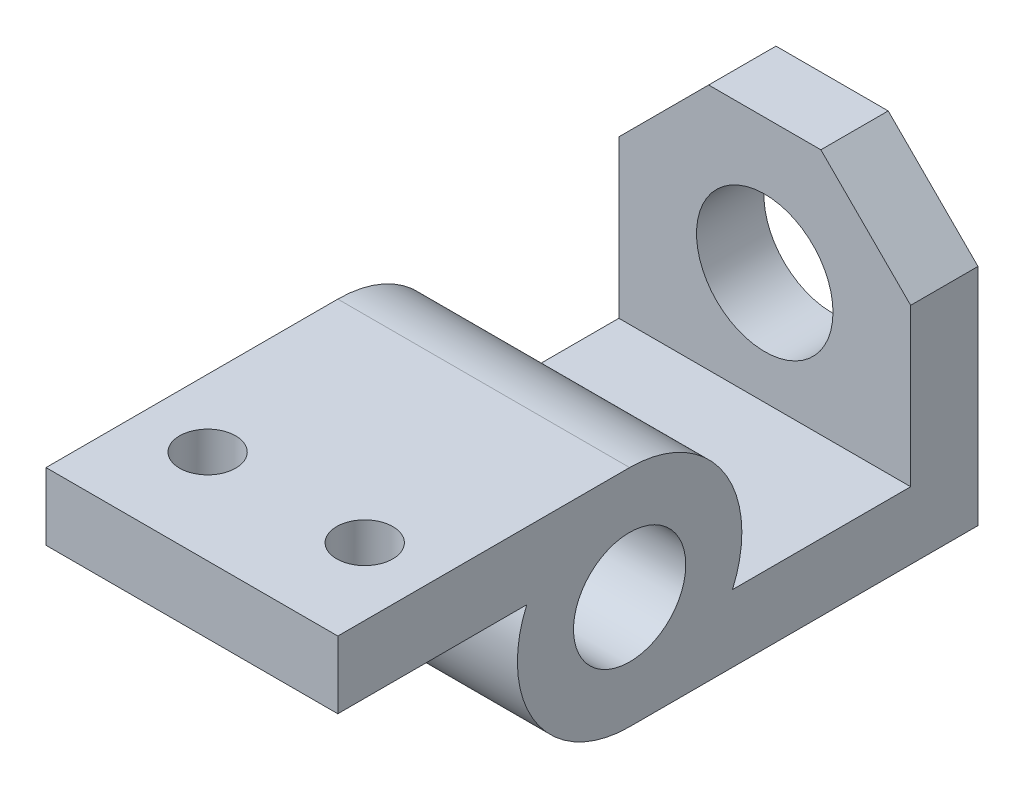
ISO-10303-21;
HEADER;
FILE_DESCRIPTION(('STEP AP214'),'2;1');
FILE_NAME('part.step','',(''),(''),'','','');
FILE_SCHEMA(('AUTOMOTIVE_DESIGN { 1 0 10303 214 1 1 1 1 }'));
ENDSEC;
DATA;
#1=APPLICATION_CONTEXT('core data for automotive mechanical design processes');
#2=APPLICATION_PROTOCOL_DEFINITION('international standard','automotive_design',2000,#1);
#3=PRODUCT_CONTEXT('',#1,'mechanical');
#4=PRODUCT('Part','Part','',(#3));
#5=PRODUCT_RELATED_PRODUCT_CATEGORY('part','',(#4));
#6=PRODUCT_DEFINITION_FORMATION('','',#4);
#7=PRODUCT_DEFINITION_CONTEXT('part definition',#1,'design');
#8=PRODUCT_DEFINITION('design','',#6,#7);
#9=PRODUCT_DEFINITION_SHAPE('','',#8);
#10=(LENGTH_UNIT() NAMED_UNIT(*) SI_UNIT(.MILLI.,.METRE.));
#11=(NAMED_UNIT(*) PLANE_ANGLE_UNIT() SI_UNIT($,.RADIAN.));
#12=(NAMED_UNIT(*) SI_UNIT($,.STERADIAN.) SOLID_ANGLE_UNIT());
#13=UNCERTAINTY_MEASURE_WITH_UNIT(LENGTH_MEASURE(1.E-05),#10,'distance_accuracy_value','');
#14=(GEOMETRIC_REPRESENTATION_CONTEXT(3) GLOBAL_UNCERTAINTY_ASSIGNED_CONTEXT((#13)) GLOBAL_UNIT_ASSIGNED_CONTEXT((#10,
#11,#12)) REPRESENTATION_CONTEXT('',''));
#15=CARTESIAN_POINT('',(0.,0.,0.));
#16=DIRECTION('',(0.,0.,1.));
#17=DIRECTION('',(1.,0.,0.));
#18=AXIS2_PLACEMENT_3D('',#15,#16,#17);
#19=CARTESIAN_POINT('',(-82.55,0.,0.));
#20=DIRECTION('',(1.,0.,0.));
#21=DIRECTION('',(0.,0.,-1.));
#22=AXIS2_PLACEMENT_3D('',#19,#20,#21);
#23=CYLINDRICAL_SURFACE('',#22,31.75);
#24=CARTESIAN_POINT('',(0.,0.,0.));
#25=DIRECTION('',(1.,0.,0.));
#26=DIRECTION('',(0.,0.,-1.));
#27=AXIS2_PLACEMENT_3D('',#24,#25,#26);
#28=CIRCLE('',#27,31.75);
#29=CARTESIAN_POINT('',(0.,-31.75,0.));
#30=VERTEX_POINT('',#29);
#31=CARTESIAN_POINT('',(0.,12.7,29.0993556629696));
#32=VERTEX_POINT('',#31);
#33=EDGE_CURVE('E204',#30,#32,#28,.F.);
#34=ORIENTED_EDGE('',*,*,#33,.T.);
#35=DIRECTION('',(1.,0.,0.));
#36=VECTOR('',#35,1.);
#37=CARTESIAN_POINT('',(-82.55,12.7,29.0993556629696));
#38=LINE('',#37,#36);
#39=CARTESIAN_POINT('',(-82.55,12.7,29.0993556629696));
#40=VERTEX_POINT('',#39);
#41=EDGE_CURVE('E12',#40,#32,#38,.T.);
#42=ORIENTED_EDGE('',*,*,#41,.F.);
#43=CARTESIAN_POINT('',(-82.55,0.,0.));
#44=DIRECTION('',(1.,0.,0.));
#45=DIRECTION('',(0.,0.,-1.));
#46=AXIS2_PLACEMENT_3D('',#43,#44,#45);
#47=CIRCLE('',#46,31.75);
#48=CARTESIAN_POINT('',(-82.55,-31.75,0.));
#49=VERTEX_POINT('',#48);
#50=EDGE_CURVE('E183',#49,#40,#47,.F.);
#51=ORIENTED_EDGE('',*,*,#50,.F.);
#52=DIRECTION('',(1.,0.,0.));
#53=VECTOR('',#52,1.);
#54=CARTESIAN_POINT('',(-82.55,-31.75,0.));
#55=LINE('',#54,#53);
#56=EDGE_CURVE('E60',#49,#30,#55,.T.);
#57=ORIENTED_EDGE('',*,*,#56,.T.);
#58=EDGE_LOOP('',(#34,#42,#51,#57));
#59=FACE_BOUND('',#58,.T.);
#60=ADVANCED_FACE('F57',(#59),#23,.T.);
#61=CARTESIAN_POINT('',(-82.55,12.7,0.));
#62=DIRECTION('',(0.,-1.,0.));
#63=DIRECTION('',(0.,0.,-1.));
#64=AXIS2_PLACEMENT_3D('',#61,#62,#63);
#65=PLANE('',#64);
#66=CARTESIAN_POINT('',(-63.5,12.7,55.88));
#67=DIRECTION('',(0.,-1.,0.));
#68=DIRECTION('',(0.,0.,-1.));
#69=AXIS2_PLACEMENT_3D('',#66,#67,#68);
#70=CIRCLE('',#69,7.9375);
#71=CARTESIAN_POINT('',(-63.5,12.7,47.9425));
#72=VERTEX_POINT('',#71);
#73=EDGE_CURVE('E207',#72,#72,#70,.T.);
#74=ORIENTED_EDGE('',*,*,#73,.F.);
#75=EDGE_LOOP('',(#74));
#76=FACE_BOUND('',#75,.T.);
#77=CARTESIAN_POINT('',(-19.05,12.7,55.88));
#78=DIRECTION('',(0.,-1.,0.));
#79=DIRECTION('',(0.,0.,-1.));
#80=AXIS2_PLACEMENT_3D('',#77,#78,#79);
#81=CIRCLE('',#80,7.9375);
#82=CARTESIAN_POINT('',(-19.05,12.7,47.9425));
#83=VERTEX_POINT('',#82);
#84=EDGE_CURVE('E234',#83,#83,#81,.T.);
#85=ORIENTED_EDGE('',*,*,#84,.F.);
#86=EDGE_LOOP('',(#85));
#87=FACE_BOUND('',#86,.T.);
#88=DIRECTION('',(0.,0.,-1.));
#89=VECTOR('',#88,1.);
#90=CARTESIAN_POINT('',(0.,12.7,0.));
#91=LINE('',#90,#89);
#92=CARTESIAN_POINT('',(0.,12.7,82.55));
#93=VERTEX_POINT('',#92);
#94=EDGE_CURVE('E184',#93,#32,#91,.T.);
#95=ORIENTED_EDGE('',*,*,#94,.F.);
#96=DIRECTION('',(1.,0.,0.));
#97=VECTOR('',#96,1.);
#98=CARTESIAN_POINT('',(-82.55,12.7,82.55));
#99=LINE('',#98,#97);
#100=CARTESIAN_POINT('',(-82.55,12.7,82.55));
#101=VERTEX_POINT('',#100);
#102=EDGE_CURVE('E65',#101,#93,#99,.T.);
#103=ORIENTED_EDGE('',*,*,#102,.F.);
#104=DIRECTION('',(0.,0.,-1.));
#105=VECTOR('',#104,1.);
#106=CARTESIAN_POINT('',(-82.55,12.7,0.));
#107=LINE('',#106,#105);
#108=EDGE_CURVE('E211',#101,#40,#107,.T.);
#109=ORIENTED_EDGE('',*,*,#108,.T.);
#110=ORIENTED_EDGE('',*,*,#41,.T.);
#111=EDGE_LOOP('',(#95,#103,#109,#110));
#112=FACE_BOUND('',#111,.T.);
#113=ADVANCED_FACE('F304',(#76,#87,#112),#65,.T.);
#114=CARTESIAN_POINT('',(-82.55,0.,82.55));
#115=DIRECTION('',(0.,0.,1.));
#116=DIRECTION('',(0.,-1.,0.));
#117=AXIS2_PLACEMENT_3D('',#114,#115,#116);
#118=PLANE('',#117);
#119=DIRECTION('',(0.,-1.,0.));
#120=VECTOR('',#119,1.);
#121=CARTESIAN_POINT('',(0.,0.,82.55));
#122=LINE('',#121,#120);
#123=CARTESIAN_POINT('',(0.,31.75,82.55));
#124=VERTEX_POINT('',#123);
#125=EDGE_CURVE('E187',#124,#93,#122,.T.);
#126=ORIENTED_EDGE('',*,*,#125,.F.);
#127=DIRECTION('',(1.,0.,0.));
#128=VECTOR('',#127,1.);
#129=CARTESIAN_POINT('',(-82.55,31.75,82.55));
#130=LINE('',#129,#128);
#131=CARTESIAN_POINT('',(-82.55,31.75,82.55));
#132=VERTEX_POINT('',#131);
#133=EDGE_CURVE('E177',#132,#124,#130,.T.);
#134=ORIENTED_EDGE('',*,*,#133,.F.);
#135=DIRECTION('',(0.,-1.,0.));
#136=VECTOR('',#135,1.);
#137=CARTESIAN_POINT('',(-82.55,0.,82.55));
#138=LINE('',#137,#136);
#139=EDGE_CURVE('E214',#132,#101,#138,.T.);
#140=ORIENTED_EDGE('',*,*,#139,.T.);
#141=ORIENTED_EDGE('',*,*,#102,.T.);
#142=EDGE_LOOP('',(#126,#134,#140,#141));
#143=FACE_BOUND('',#142,.T.);
#144=ADVANCED_FACE('F310',(#143),#118,.T.);
#145=CARTESIAN_POINT('',(-82.55,31.75,0.));
#146=DIRECTION('',(0.,1.,0.));
#147=DIRECTION('',(0.,0.,1.));
#148=AXIS2_PLACEMENT_3D('',#145,#146,#147);
#149=PLANE('',#148);
#150=CARTESIAN_POINT('',(-63.5,31.75,55.88));
#151=DIRECTION('',(0.,1.,0.));
#152=DIRECTION('',(0.,0.,1.));
#153=AXIS2_PLACEMENT_3D('',#150,#151,#152);
#154=CIRCLE('',#153,7.9375);
#155=CARTESIAN_POINT('',(-63.5,31.75,63.8175));
#156=VERTEX_POINT('',#155);
#157=EDGE_CURVE('E237',#156,#156,#154,.T.);
#158=ORIENTED_EDGE('',*,*,#157,.F.);
#159=EDGE_LOOP('',(#158));
#160=FACE_BOUND('',#159,.T.);
#161=CARTESIAN_POINT('',(-19.05,31.75,55.88));
#162=DIRECTION('',(0.,1.,0.));
#163=DIRECTION('',(0.,0.,1.));
#164=AXIS2_PLACEMENT_3D('',#161,#162,#163);
#165=CIRCLE('',#164,7.9375);
#166=CARTESIAN_POINT('',(-19.05,31.75,63.8175));
#167=VERTEX_POINT('',#166);
#168=EDGE_CURVE('E238',#167,#167,#165,.T.);
#169=ORIENTED_EDGE('',*,*,#168,.F.);
#170=EDGE_LOOP('',(#169));
#171=FACE_BOUND('',#170,.T.);
#172=DIRECTION('',(0.,0.,1.));
#173=VECTOR('',#172,1.);
#174=CARTESIAN_POINT('',(0.,31.75,0.));
#175=LINE('',#174,#173);
#176=CARTESIAN_POINT('',(0.,31.75,0.));
#177=VERTEX_POINT('',#176);
#178=EDGE_CURVE('E190',#177,#124,#175,.T.);
#179=ORIENTED_EDGE('',*,*,#178,.F.);
#180=DIRECTION('',(1.,0.,0.));
#181=VECTOR('',#180,1.);
#182=CARTESIAN_POINT('',(-82.55,31.75,0.));
#183=LINE('',#182,#181);
#184=CARTESIAN_POINT('',(-82.55,31.75,0.));
#185=VERTEX_POINT('',#184);
#186=EDGE_CURVE('E175',#185,#177,#183,.T.);
#187=ORIENTED_EDGE('',*,*,#186,.F.);
#188=DIRECTION('',(0.,0.,1.));
#189=VECTOR('',#188,1.);
#190=CARTESIAN_POINT('',(-82.55,31.75,0.));
#191=LINE('',#190,#189);
#192=EDGE_CURVE('E217',#185,#132,#191,.T.);
#193=ORIENTED_EDGE('',*,*,#192,.T.);
#194=ORIENTED_EDGE('',*,*,#133,.T.);
#195=EDGE_LOOP('',(#179,#187,#193,#194));
#196=FACE_BOUND('',#195,.T.);
#197=ADVANCED_FACE('F321',(#160,#171,#196),#149,.T.);
#198=CARTESIAN_POINT('',(-82.55,0.,0.));
#199=DIRECTION('',(1.,0.,0.));
#200=DIRECTION('',(0.,0.,-1.));
#201=AXIS2_PLACEMENT_3D('',#198,#199,#200);
#202=CYLINDRICAL_SURFACE('',#201,31.75);
#203=CARTESIAN_POINT('',(0.,0.,0.));
#204=DIRECTION('',(1.,0.,0.));
#205=DIRECTION('',(0.,0.,-1.));
#206=AXIS2_PLACEMENT_3D('',#203,#204,#205);
#207=CIRCLE('',#206,31.75);
#208=CARTESIAN_POINT('',(0.,-12.7,-29.0993556629696));
#209=VERTEX_POINT('',#208);
#210=EDGE_CURVE('E193',#177,#209,#207,.F.);
#211=ORIENTED_EDGE('',*,*,#210,.T.);
#212=DIRECTION('',(1.,0.,0.));
#213=VECTOR('',#212,1.);
#214=CARTESIAN_POINT('',(-82.55,-12.7,-29.0993556629696));
#215=LINE('',#214,#213);
#216=CARTESIAN_POINT('',(-82.55,-12.7,-29.0993556629696));
#217=VERTEX_POINT('',#216);
#218=EDGE_CURVE('E172',#217,#209,#215,.T.);
#219=ORIENTED_EDGE('',*,*,#218,.F.);
#220=CARTESIAN_POINT('',(-82.55,0.,0.));
#221=DIRECTION('',(1.,0.,0.));
#222=DIRECTION('',(0.,0.,-1.));
#223=AXIS2_PLACEMENT_3D('',#220,#221,#222);
#224=CIRCLE('',#223,31.75);
#225=EDGE_CURVE('E220',#185,#217,#224,.F.);
#226=ORIENTED_EDGE('',*,*,#225,.F.);
#227=ORIENTED_EDGE('',*,*,#186,.T.);
#228=EDGE_LOOP('',(#211,#219,#226,#227));
#229=FACE_BOUND('',#228,.T.);
#230=ADVANCED_FACE('F325',(#229),#202,.T.);
#231=CARTESIAN_POINT('',(-82.55,-12.7,0.));
#232=DIRECTION('',(0.,-1.,0.));
#233=DIRECTION('',(0.,0.,-1.));
#234=AXIS2_PLACEMENT_3D('',#231,#232,#233);
#235=PLANE('',#234);
#236=DIRECTION('',(0.,0.,-1.));
#237=VECTOR('',#236,1.);
#238=CARTESIAN_POINT('',(0.,-12.7,0.));
#239=LINE('',#238,#237);
#240=CARTESIAN_POINT('',(0.,-12.7,-79.502));
#241=VERTEX_POINT('',#240);
#242=EDGE_CURVE('E195',#209,#241,#239,.T.);
#243=ORIENTED_EDGE('',*,*,#242,.T.);
#244=DIRECTION('',(1.,0.,0.));
#245=VECTOR('',#244,1.);
#246=CARTESIAN_POINT('',(-82.55,-12.7,-79.502));
#247=LINE('',#246,#245);
#248=CARTESIAN_POINT('',(-82.55,-12.7,-79.502));
#249=VERTEX_POINT('',#248);
#250=EDGE_CURVE('E166',#249,#241,#247,.T.);
#251=ORIENTED_EDGE('',*,*,#250,.F.);
#252=DIRECTION('',(0.,0.,-1.));
#253=VECTOR('',#252,1.);
#254=CARTESIAN_POINT('',(-82.55,-12.7,0.));
#255=LINE('',#254,#253);
#256=EDGE_CURVE('E222',#217,#249,#255,.T.);
#257=ORIENTED_EDGE('',*,*,#256,.F.);
#258=ORIENTED_EDGE('',*,*,#218,.T.);
#259=EDGE_LOOP('',(#243,#251,#257,#258));
#260=FACE_BOUND('',#259,.T.);
#261=ADVANCED_FACE('F270',(#260),#235,.F.);
#262=CARTESIAN_POINT('',(-82.55,0.,-79.502));
#263=DIRECTION('',(0.,0.,-1.));
#264=DIRECTION('',(-1.,0.,0.));
#265=AXIS2_PLACEMENT_3D('',#262,#263,#264);
#266=PLANE('',#265);
#267=CARTESIAN_POINT('',(-41.275,19.05,-79.502));
#268=DIRECTION('',(0.,0.,1.));
#269=DIRECTION('',(1.,0.,0.));
#270=AXIS2_PLACEMENT_3D('',#267,#268,#269);
#271=CIRCLE('',#270,19.304);
#272=CARTESIAN_POINT('',(-21.971,19.05,-79.502));
#273=VERTEX_POINT('',#272);
#274=EDGE_CURVE('E253',#273,#273,#271,.T.);
#275=ORIENTED_EDGE('',*,*,#274,.F.);
#276=EDGE_LOOP('',(#275));
#277=FACE_BOUND('',#276,.T.);
#278=DIRECTION('',(0.,1.,0.));
#279=VECTOR('',#278,1.);
#280=CARTESIAN_POINT('',(0.,0.,-79.502));
#281=LINE('',#280,#279);
#282=CARTESIAN_POINT('',(0.,31.75,-79.502));
#283=VERTEX_POINT('',#282);
#284=EDGE_CURVE('E197',#241,#283,#281,.T.);
#285=ORIENTED_EDGE('',*,*,#284,.T.);
#286=DIRECTION('',(0.707106781186548,-0.707106781186548,0.));
#287=VECTOR('',#286,1.);
#288=CARTESIAN_POINT('',(15.875,15.875,-79.502));
#289=LINE('',#288,#287);
#290=CARTESIAN_POINT('',(-25.4,57.15,-79.502));
#291=VERTEX_POINT('',#290);
#292=EDGE_CURVE('E81',#291,#283,#289,.T.);
#293=ORIENTED_EDGE('',*,*,#292,.F.);
#294=DIRECTION('',(1.,0.,0.));
#295=VECTOR('',#294,1.);
#296=CARTESIAN_POINT('',(-82.55,57.15,-79.502));
#297=LINE('',#296,#295);
#298=CARTESIAN_POINT('',(-57.15,57.15,-79.502));
#299=VERTEX_POINT('',#298);
#300=EDGE_CURVE('E160',#299,#291,#297,.T.);
#301=ORIENTED_EDGE('',*,*,#300,.F.);
#302=DIRECTION('',(0.707106781186548,0.707106781186548,0.));
#303=VECTOR('',#302,1.);
#304=CARTESIAN_POINT('',(-57.15,57.15,-79.502));
#305=LINE('',#304,#303);
#306=CARTESIAN_POINT('',(-82.55,31.75,-79.502));
#307=VERTEX_POINT('',#306);
#308=EDGE_CURVE('E247',#307,#299,#305,.T.);
#309=ORIENTED_EDGE('',*,*,#308,.F.);
#310=DIRECTION('',(0.,1.,0.));
#311=VECTOR('',#310,1.);
#312=CARTESIAN_POINT('',(-82.55,0.,-79.502));
#313=LINE('',#312,#311);
#314=EDGE_CURVE('E224',#249,#307,#313,.T.);
#315=ORIENTED_EDGE('',*,*,#314,.F.);
#316=ORIENTED_EDGE('',*,*,#250,.T.);
#317=EDGE_LOOP('',(#285,#293,#301,#309,#315,#316));
#318=FACE_BOUND('',#317,.T.);
#319=ADVANCED_FACE('F267',(#277,#318),#266,.F.);
#320=CARTESIAN_POINT('',(-82.55,57.15,0.));
#321=DIRECTION('',(0.,-1.,0.));
#322=DIRECTION('',(0.,0.,-1.));
#323=AXIS2_PLACEMENT_3D('',#320,#321,#322);
#324=PLANE('',#323);
#325=ORIENTED_EDGE('',*,*,#300,.T.);
#326=DIRECTION('',(0.,0.,1.));
#327=VECTOR('',#326,1.);
#328=CARTESIAN_POINT('',(-25.4,57.15,-98.552));
#329=LINE('',#328,#327);
#330=CARTESIAN_POINT('',(-25.4,57.15,-98.552));
#331=VERTEX_POINT('',#330);
#332=EDGE_CURVE('E147',#331,#291,#329,.T.);
#333=ORIENTED_EDGE('',*,*,#332,.F.);
#334=DIRECTION('',(1.,0.,0.));
#335=VECTOR('',#334,1.);
#336=CARTESIAN_POINT('',(-82.55,57.15,-98.552));
#337=LINE('',#336,#335);
#338=CARTESIAN_POINT('',(-57.15,57.15,-98.552));
#339=VERTEX_POINT('',#338);
#340=EDGE_CURVE('E158',#339,#331,#337,.T.);
#341=ORIENTED_EDGE('',*,*,#340,.F.);
#342=DIRECTION('',(0.,0.,1.));
#343=VECTOR('',#342,1.);
#344=CARTESIAN_POINT('',(-57.15,57.15,-98.552));
#345=LINE('',#344,#343);
#346=EDGE_CURVE('E241',#339,#299,#345,.T.);
#347=ORIENTED_EDGE('',*,*,#346,.T.);
#348=EDGE_LOOP('',(#325,#333,#341,#347));
#349=FACE_BOUND('',#348,.T.);
#350=ADVANCED_FACE('F156',(#349),#324,.F.);
#351=CARTESIAN_POINT('',(-82.55,0.,-98.552));
#352=DIRECTION('',(0.,0.,1.));
#353=DIRECTION('',(0.,-1.,0.));
#354=AXIS2_PLACEMENT_3D('',#351,#352,#353);
#355=PLANE('',#354);
#356=CARTESIAN_POINT('',(-41.275,19.05,-98.552));
#357=DIRECTION('',(0.,0.,1.));
#358=DIRECTION('',(1.,0.,0.));
#359=AXIS2_PLACEMENT_3D('',#356,#357,#358);
#360=CIRCLE('',#359,19.304);
#361=CARTESIAN_POINT('',(-21.971,19.05,-98.552));
#362=VERTEX_POINT('',#361);
#363=EDGE_CURVE('E251',#362,#362,#360,.T.);
#364=ORIENTED_EDGE('',*,*,#363,.T.);
#365=EDGE_LOOP('',(#364));
#366=FACE_BOUND('',#365,.T.);
#367=ORIENTED_EDGE('',*,*,#340,.T.);
#368=DIRECTION('',(0.707106781186548,-0.707106781186548,0.));
#369=VECTOR('',#368,1.);
#370=CARTESIAN_POINT('',(15.875,15.875,-98.552));
#371=LINE('',#370,#369);
#372=CARTESIAN_POINT('',(0.,31.75,-98.552));
#373=VERTEX_POINT('',#372);
#374=EDGE_CURVE('E144',#331,#373,#371,.T.);
#375=ORIENTED_EDGE('',*,*,#374,.T.);
#376=DIRECTION('',(0.,-1.,0.));
#377=VECTOR('',#376,1.);
#378=CARTESIAN_POINT('',(0.,0.,-98.552));
#379=LINE('',#378,#377);
#380=CARTESIAN_POINT('',(0.,-31.75,-98.552));
#381=VERTEX_POINT('',#380);
#382=EDGE_CURVE('E200',#373,#381,#379,.T.);
#383=ORIENTED_EDGE('',*,*,#382,.T.);
#384=DIRECTION('',(1.,0.,0.));
#385=VECTOR('',#384,1.);
#386=CARTESIAN_POINT('',(-82.55,-31.75,-98.552));
#387=LINE('',#386,#385);
#388=CARTESIAN_POINT('',(-82.55,-31.75,-98.552));
#389=VERTEX_POINT('',#388);
#390=EDGE_CURVE('E164',#389,#381,#387,.T.);
#391=ORIENTED_EDGE('',*,*,#390,.F.);
#392=DIRECTION('',(0.,-1.,0.));
#393=VECTOR('',#392,1.);
#394=CARTESIAN_POINT('',(-82.55,0.,-98.552));
#395=LINE('',#394,#393);
#396=CARTESIAN_POINT('',(-82.55,31.75,-98.552));
#397=VERTEX_POINT('',#396);
#398=EDGE_CURVE('E227',#397,#389,#395,.T.);
#399=ORIENTED_EDGE('',*,*,#398,.F.);
#400=DIRECTION('',(0.707106781186548,0.707106781186548,0.));
#401=VECTOR('',#400,1.);
#402=CARTESIAN_POINT('',(-57.15,57.15,-98.552));
#403=LINE('',#402,#401);
#404=EDGE_CURVE('E73',#397,#339,#403,.T.);
#405=ORIENTED_EDGE('',*,*,#404,.T.);
#406=EDGE_LOOP('',(#367,#375,#383,#391,#399,#405));
#407=FACE_BOUND('',#406,.T.);
#408=ADVANCED_FACE('F162',(#366,#407),#355,.F.);
#409=CARTESIAN_POINT('',(-82.55,-31.75,0.));
#410=DIRECTION('',(0.,1.,0.));
#411=DIRECTION('',(0.,0.,1.));
#412=AXIS2_PLACEMENT_3D('',#409,#410,#411);
#413=PLANE('',#412);
#414=DIRECTION('',(0.,0.,1.));
#415=VECTOR('',#414,1.);
#416=CARTESIAN_POINT('',(0.,-31.75,0.));
#417=LINE('',#416,#415);
#418=EDGE_CURVE('E202',#381,#30,#417,.T.);
#419=ORIENTED_EDGE('',*,*,#418,.T.);
#420=ORIENTED_EDGE('',*,*,#56,.F.);
#421=DIRECTION('',(0.,0.,1.));
#422=VECTOR('',#421,1.);
#423=CARTESIAN_POINT('',(-82.55,-31.75,0.));
#424=LINE('',#423,#422);
#425=EDGE_CURVE('E229',#389,#49,#424,.T.);
#426=ORIENTED_EDGE('',*,*,#425,.F.);
#427=ORIENTED_EDGE('',*,*,#390,.T.);
#428=EDGE_LOOP('',(#419,#420,#426,#427));
#429=FACE_BOUND('',#428,.T.);
#430=ADVANCED_FACE('F285',(#429),#413,.F.);
#431=CARTESIAN_POINT('',(-82.55,0.,0.));
#432=DIRECTION('',(1.,0.,0.));
#433=DIRECTION('',(0.,0.,-1.));
#434=AXIS2_PLACEMENT_3D('',#431,#432,#433);
#435=CYLINDRICAL_SURFACE('',#434,15.875);
#436=CARTESIAN_POINT('',(-82.55,0.,0.));
#437=DIRECTION('',(1.,0.,0.));
#438=DIRECTION('',(0.,0.,-1.));
#439=AXIS2_PLACEMENT_3D('',#436,#437,#438);
#440=CIRCLE('',#439,15.875);
#441=CARTESIAN_POINT('',(-82.55,0.,-15.875));
#442=VERTEX_POINT('',#441);
#443=EDGE_CURVE('E208',#442,#442,#440,.T.);
#444=ORIENTED_EDGE('',*,*,#443,.F.);
#445=EDGE_LOOP('',(#444));
#446=FACE_BOUND('',#445,.T.);
#447=CARTESIAN_POINT('',(0.,0.,0.));
#448=DIRECTION('',(1.,0.,0.));
#449=DIRECTION('',(0.,0.,-1.));
#450=AXIS2_PLACEMENT_3D('',#447,#448,#449);
#451=CIRCLE('',#450,15.875);
#452=CARTESIAN_POINT('',(0.,0.,-15.875));
#453=VERTEX_POINT('',#452);
#454=EDGE_CURVE('E180',#453,#453,#451,.T.);
#455=ORIENTED_EDGE('',*,*,#454,.T.);
#456=EDGE_LOOP('',(#455));
#457=FACE_BOUND('',#456,.T.);
#458=ADVANCED_FACE('F341',(#446,#457),#435,.F.);
#459=CARTESIAN_POINT('',(-82.55,0.,0.));
#460=DIRECTION('',(1.,0.,0.));
#461=DIRECTION('',(0.,0.,-1.));
#462=AXIS2_PLACEMENT_3D('',#459,#460,#461);
#463=PLANE('',#462);
#464=ORIENTED_EDGE('',*,*,#314,.T.);
#465=DIRECTION('',(0.,0.,1.));
#466=VECTOR('',#465,1.);
#467=CARTESIAN_POINT('',(-82.55,31.75,-98.552));
#468=LINE('',#467,#466);
#469=EDGE_CURVE('E244',#397,#307,#468,.T.);
#470=ORIENTED_EDGE('',*,*,#469,.F.);
#471=ORIENTED_EDGE('',*,*,#398,.T.);
#472=ORIENTED_EDGE('',*,*,#425,.T.);
#473=ORIENTED_EDGE('',*,*,#50,.T.);
#474=ORIENTED_EDGE('',*,*,#108,.F.);
#475=ORIENTED_EDGE('',*,*,#139,.F.);
#476=ORIENTED_EDGE('',*,*,#192,.F.);
#477=ORIENTED_EDGE('',*,*,#225,.T.);
#478=ORIENTED_EDGE('',*,*,#256,.T.);
#479=EDGE_LOOP('',(#464,#470,#471,#472,#473,#474,#475,#476,#477,#478));
#480=FACE_BOUND('',#479,.T.);
#481=ORIENTED_EDGE('',*,*,#443,.T.);
#482=EDGE_LOOP('',(#481));
#483=FACE_BOUND('',#482,.T.);
#484=ADVANCED_FACE('F290',(#480,#483),#463,.F.);
#485=CARTESIAN_POINT('',(0.,0.,0.));
#486=DIRECTION('',(1.,0.,0.));
#487=DIRECTION('',(0.,0.,-1.));
#488=AXIS2_PLACEMENT_3D('',#485,#486,#487);
#489=PLANE('',#488);
#490=DIRECTION('',(0.,0.,1.));
#491=VECTOR('',#490,1.);
#492=CARTESIAN_POINT('',(0.,31.75,-98.552));
#493=LINE('',#492,#491);
#494=EDGE_CURVE('E148',#373,#283,#493,.T.);
#495=ORIENTED_EDGE('',*,*,#494,.T.);
#496=ORIENTED_EDGE('',*,*,#284,.F.);
#497=ORIENTED_EDGE('',*,*,#242,.F.);
#498=ORIENTED_EDGE('',*,*,#210,.F.);
#499=ORIENTED_EDGE('',*,*,#178,.T.);
#500=ORIENTED_EDGE('',*,*,#125,.T.);
#501=ORIENTED_EDGE('',*,*,#94,.T.);
#502=ORIENTED_EDGE('',*,*,#33,.F.);
#503=ORIENTED_EDGE('',*,*,#418,.F.);
#504=ORIENTED_EDGE('',*,*,#382,.F.);
#505=EDGE_LOOP('',(#495,#496,#497,#498,#499,#500,#501,#502,#503,#504));
#506=FACE_BOUND('',#505,.T.);
#507=ORIENTED_EDGE('',*,*,#454,.F.);
#508=EDGE_LOOP('',(#507));
#509=FACE_BOUND('',#508,.T.);
#510=ADVANCED_FACE('F277',(#506,#509),#489,.T.);
#511=CARTESIAN_POINT('',(-19.05,-31.75,55.88));
#512=DIRECTION('',(0.,1.,0.));
#513=DIRECTION('',(0.,0.,1.));
#514=AXIS2_PLACEMENT_3D('',#511,#512,#513);
#515=CYLINDRICAL_SURFACE('',#514,7.9375);
#516=ORIENTED_EDGE('',*,*,#84,.T.);
#517=EDGE_LOOP('',(#516));
#518=FACE_BOUND('',#517,.T.);
#519=ORIENTED_EDGE('',*,*,#168,.T.);
#520=EDGE_LOOP('',(#519));
#521=FACE_BOUND('',#520,.T.);
#522=ADVANCED_FACE('F367',(#518,#521),#515,.F.);
#523=CARTESIAN_POINT('',(-63.5,-31.75,55.88));
#524=DIRECTION('',(0.,1.,0.));
#525=DIRECTION('',(0.,0.,1.));
#526=AXIS2_PLACEMENT_3D('',#523,#524,#525);
#527=CYLINDRICAL_SURFACE('',#526,7.9375);
#528=ORIENTED_EDGE('',*,*,#73,.T.);
#529=EDGE_LOOP('',(#528));
#530=FACE_BOUND('',#529,.T.);
#531=ORIENTED_EDGE('',*,*,#157,.T.);
#532=EDGE_LOOP('',(#531));
#533=FACE_BOUND('',#532,.T.);
#534=ADVANCED_FACE('F300',(#530,#533),#527,.F.);
#535=CARTESIAN_POINT('',(15.875,15.875,-98.552));
#536=DIRECTION('',(-0.707106781186548,-0.707106781186548,0.));
#537=DIRECTION('',(0.707106781186548,-0.707106781186548,0.));
#538=AXIS2_PLACEMENT_3D('',#535,#536,#537);
#539=PLANE('',#538);
#540=ORIENTED_EDGE('',*,*,#292,.T.);
#541=ORIENTED_EDGE('',*,*,#494,.F.);
#542=ORIENTED_EDGE('',*,*,#374,.F.);
#543=ORIENTED_EDGE('',*,*,#332,.T.);
#544=EDGE_LOOP('',(#540,#541,#542,#543));
#545=FACE_BOUND('',#544,.T.);
#546=ADVANCED_FACE('F146',(#545),#539,.F.);
#547=CARTESIAN_POINT('',(-57.15,57.15,-98.552));
#548=DIRECTION('',(0.707106781186548,-0.707106781186548,0.));
#549=DIRECTION('',(0.707106781186548,0.707106781186548,0.));
#550=AXIS2_PLACEMENT_3D('',#547,#548,#549);
#551=PLANE('',#550);
#552=ORIENTED_EDGE('',*,*,#308,.T.);
#553=ORIENTED_EDGE('',*,*,#346,.F.);
#554=ORIENTED_EDGE('',*,*,#404,.F.);
#555=ORIENTED_EDGE('',*,*,#469,.T.);
#556=EDGE_LOOP('',(#552,#553,#554,#555));
#557=FACE_BOUND('',#556,.T.);
#558=ADVANCED_FACE('F263',(#557),#551,.F.);
#559=CARTESIAN_POINT('',(-41.275,19.05,-98.552));
#560=DIRECTION('',(0.,0.,1.));
#561=DIRECTION('',(1.,0.,0.));
#562=AXIS2_PLACEMENT_3D('',#559,#560,#561);
#563=CYLINDRICAL_SURFACE('',#562,19.304);
#564=ORIENTED_EDGE('',*,*,#363,.F.);
#565=EDGE_LOOP('',(#564));
#566=FACE_BOUND('',#565,.T.);
#567=ORIENTED_EDGE('',*,*,#274,.T.);
#568=EDGE_LOOP('',(#567));
#569=FACE_BOUND('',#568,.T.);
#570=ADVANCED_FACE('F260',(#566,#569),#563,.F.);
#571=CLOSED_SHELL('',(#60,#113,#144,#197,#230,#261,#319,#350,#408,#430,#458,#484,#510,#522,#534,
#546,#558,#570));
#572=MANIFOLD_SOLID_BREP('B2',#571);
#573=ADVANCED_BREP_SHAPE_REPRESENTATION('',(#18,#572),#14);
#574=SHAPE_DEFINITION_REPRESENTATION(#9,#573);
ENDSEC;
END-ISO-10303-21;
